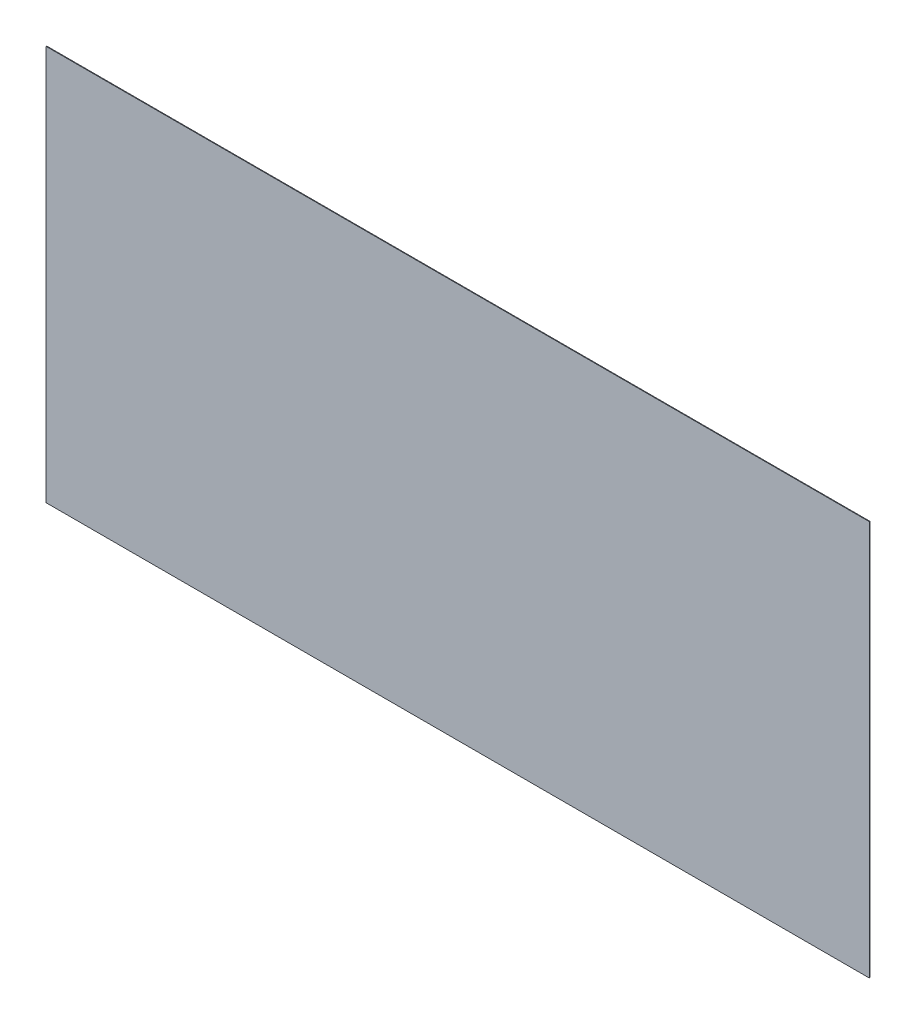
ISO-10303-21;
HEADER;
FILE_DESCRIPTION(('STEP AP214'),'2;1');
FILE_NAME('part.step','',(''),(''),'','','');
FILE_SCHEMA(('AUTOMOTIVE_DESIGN { 1 0 10303 214 1 1 1 1 }'));
ENDSEC;
DATA;
#1=APPLICATION_CONTEXT('core data for automotive mechanical design processes');
#2=APPLICATION_PROTOCOL_DEFINITION('international standard','automotive_design',2000,#1);
#3=PRODUCT_CONTEXT('',#1,'mechanical');
#4=PRODUCT('Part','Part','',(#3));
#5=PRODUCT_RELATED_PRODUCT_CATEGORY('part','',(#4));
#6=PRODUCT_DEFINITION_FORMATION('','',#4);
#7=PRODUCT_DEFINITION_CONTEXT('part definition',#1,'design');
#8=PRODUCT_DEFINITION('design','',#6,#7);
#9=PRODUCT_DEFINITION_SHAPE('','',#8);
#10=(LENGTH_UNIT() NAMED_UNIT(*) SI_UNIT(.MILLI.,.METRE.));
#11=(NAMED_UNIT(*) PLANE_ANGLE_UNIT() SI_UNIT($,.RADIAN.));
#12=(NAMED_UNIT(*) SI_UNIT($,.STERADIAN.) SOLID_ANGLE_UNIT());
#13=UNCERTAINTY_MEASURE_WITH_UNIT(LENGTH_MEASURE(1.E-05),#10,'distance_accuracy_value','');
#14=(GEOMETRIC_REPRESENTATION_CONTEXT(3) GLOBAL_UNCERTAINTY_ASSIGNED_CONTEXT((#13)) GLOBAL_UNIT_ASSIGNED_CONTEXT((#10,
#11,#12)) REPRESENTATION_CONTEXT('',''));
#15=CARTESIAN_POINT('',(0.,0.,0.));
#16=DIRECTION('',(0.,0.,1.));
#17=DIRECTION('',(1.,0.,0.));
#18=AXIS2_PLACEMENT_3D('',#15,#16,#17);
#19=CARTESIAN_POINT('',(600.,288.1,0.9));
#20=DIRECTION('',(-1.,0.,0.));
#21=DIRECTION('',(0.,-1.,0.));
#22=AXIS2_PLACEMENT_3D('',#19,#20,#21);
#23=PLANE('',#22);
#24=DIRECTION('',(0.,1.,0.));
#25=VECTOR('',#24,1.);
#26=CARTESIAN_POINT('',(600.,288.1,0.));
#27=LINE('',#26,#25);
#28=CARTESIAN_POINT('',(600.,-288.1,0.));
#29=VERTEX_POINT('',#28);
#30=CARTESIAN_POINT('',(600.,288.1,0.));
#31=VERTEX_POINT('',#30);
#32=EDGE_CURVE('E102',#29,#31,#27,.T.);
#33=ORIENTED_EDGE('',*,*,#32,.T.);
#34=DIRECTION('',(0.,0.,-1.));
#35=VECTOR('',#34,1.);
#36=CARTESIAN_POINT('',(600.,288.1,0.9));
#37=LINE('',#36,#35);
#38=CARTESIAN_POINT('',(600.,288.1,0.9));
#39=VERTEX_POINT('',#38);
#40=EDGE_CURVE('E11',#39,#31,#37,.T.);
#41=ORIENTED_EDGE('',*,*,#40,.F.);
#42=DIRECTION('',(0.,1.,0.));
#43=VECTOR('',#42,1.);
#44=CARTESIAN_POINT('',(600.,288.1,0.9));
#45=LINE('',#44,#43);
#46=CARTESIAN_POINT('',(600.,-288.1,0.9));
#47=VERTEX_POINT('',#46);
#48=EDGE_CURVE('E90',#47,#39,#45,.T.);
#49=ORIENTED_EDGE('',*,*,#48,.F.);
#50=DIRECTION('',(0.,0.,-1.));
#51=VECTOR('',#50,1.);
#52=CARTESIAN_POINT('',(600.,-288.1,0.9));
#53=LINE('',#52,#51);
#54=EDGE_CURVE('E98',#47,#29,#53,.T.);
#55=ORIENTED_EDGE('',*,*,#54,.T.);
#56=EDGE_LOOP('',(#33,#41,#49,#55));
#57=FACE_BOUND('',#56,.T.);
#58=ADVANCED_FACE('F39',(#57),#23,.F.);
#59=CARTESIAN_POINT('',(-600.,288.1,0.9));
#60=DIRECTION('',(0.,-1.,0.));
#61=DIRECTION('',(0.,0.,-1.));
#62=AXIS2_PLACEMENT_3D('',#59,#60,#61);
#63=PLANE('',#62);
#64=DIRECTION('',(-1.,0.,0.));
#65=VECTOR('',#64,1.);
#66=CARTESIAN_POINT('',(-600.,288.1,0.));
#67=LINE('',#66,#65);
#68=CARTESIAN_POINT('',(-600.,288.1,0.));
#69=VERTEX_POINT('',#68);
#70=EDGE_CURVE('E94',#31,#69,#67,.T.);
#71=ORIENTED_EDGE('',*,*,#70,.T.);
#72=DIRECTION('',(0.,0.,-1.));
#73=VECTOR('',#72,1.);
#74=CARTESIAN_POINT('',(-600.,288.1,0.9));
#75=LINE('',#74,#73);
#76=CARTESIAN_POINT('',(-600.,288.1,0.9));
#77=VERTEX_POINT('',#76);
#78=EDGE_CURVE('E47',#77,#69,#75,.T.);
#79=ORIENTED_EDGE('',*,*,#78,.F.);
#80=DIRECTION('',(-1.,0.,0.));
#81=VECTOR('',#80,1.);
#82=CARTESIAN_POINT('',(-600.,288.1,0.9));
#83=LINE('',#82,#81);
#84=EDGE_CURVE('E85',#39,#77,#83,.T.);
#85=ORIENTED_EDGE('',*,*,#84,.F.);
#86=ORIENTED_EDGE('',*,*,#40,.T.);
#87=EDGE_LOOP('',(#71,#79,#85,#86));
#88=FACE_BOUND('',#87,.T.);
#89=ADVANCED_FACE('F93',(#88),#63,.F.);
#90=CARTESIAN_POINT('',(-600.,288.1,0.9));
#91=DIRECTION('',(1.,0.,0.));
#92=DIRECTION('',(0.,1.,0.));
#93=AXIS2_PLACEMENT_3D('',#90,#91,#92);
#94=PLANE('',#93);
#95=DIRECTION('',(0.,-1.,0.));
#96=VECTOR('',#95,1.);
#97=CARTESIAN_POINT('',(-600.,288.1,0.));
#98=LINE('',#97,#96);
#99=CARTESIAN_POINT('',(-600.,-288.1,0.));
#100=VERTEX_POINT('',#99);
#101=EDGE_CURVE('E72',#69,#100,#98,.T.);
#102=ORIENTED_EDGE('',*,*,#101,.T.);
#103=DIRECTION('',(0.,0.,-1.));
#104=VECTOR('',#103,1.);
#105=CARTESIAN_POINT('',(-600.,-288.1,0.9));
#106=LINE('',#105,#104);
#107=CARTESIAN_POINT('',(-600.,-288.1,0.9));
#108=VERTEX_POINT('',#107);
#109=EDGE_CURVE('E95',#108,#100,#106,.T.);
#110=ORIENTED_EDGE('',*,*,#109,.F.);
#111=DIRECTION('',(0.,-1.,0.));
#112=VECTOR('',#111,1.);
#113=CARTESIAN_POINT('',(-600.,288.1,0.9));
#114=LINE('',#113,#112);
#115=EDGE_CURVE('E88',#77,#108,#114,.T.);
#116=ORIENTED_EDGE('',*,*,#115,.F.);
#117=ORIENTED_EDGE('',*,*,#78,.T.);
#118=EDGE_LOOP('',(#102,#110,#116,#117));
#119=FACE_BOUND('',#118,.T.);
#120=ADVANCED_FACE('F96',(#119),#94,.F.);
#121=CARTESIAN_POINT('',(-600.,-288.1,0.9));
#122=DIRECTION('',(0.,1.,0.));
#123=DIRECTION('',(0.,0.,1.));
#124=AXIS2_PLACEMENT_3D('',#121,#122,#123);
#125=PLANE('',#124);
#126=DIRECTION('',(1.,0.,0.));
#127=VECTOR('',#126,1.);
#128=CARTESIAN_POINT('',(-600.,-288.1,0.));
#129=LINE('',#128,#127);
#130=EDGE_CURVE('E78',#100,#29,#129,.T.);
#131=ORIENTED_EDGE('',*,*,#130,.T.);
#132=ORIENTED_EDGE('',*,*,#54,.F.);
#133=DIRECTION('',(1.,0.,0.));
#134=VECTOR('',#133,1.);
#135=CARTESIAN_POINT('',(-600.,-288.1,0.9));
#136=LINE('',#135,#134);
#137=EDGE_CURVE('E55',#108,#47,#136,.T.);
#138=ORIENTED_EDGE('',*,*,#137,.F.);
#139=ORIENTED_EDGE('',*,*,#109,.T.);
#140=EDGE_LOOP('',(#131,#132,#138,#139));
#141=FACE_BOUND('',#140,.T.);
#142=ADVANCED_FACE('F109',(#141),#125,.F.);
#143=CARTESIAN_POINT('',(0.,0.,0.9));
#144=DIRECTION('',(0.,0.,1.));
#145=DIRECTION('',(1.,0.,0.));
#146=AXIS2_PLACEMENT_3D('',#143,#144,#145);
#147=PLANE('',#146);
#148=ORIENTED_EDGE('',*,*,#48,.T.);
#149=ORIENTED_EDGE('',*,*,#84,.T.);
#150=ORIENTED_EDGE('',*,*,#115,.T.);
#151=ORIENTED_EDGE('',*,*,#137,.T.);
#152=EDGE_LOOP('',(#148,#149,#150,#151));
#153=FACE_BOUND('',#152,.T.);
#154=ADVANCED_FACE('F86',(#153),#147,.T.);
#155=CARTESIAN_POINT('',(0.,0.,0.));
#156=DIRECTION('',(0.,0.,1.));
#157=DIRECTION('',(1.,0.,0.));
#158=AXIS2_PLACEMENT_3D('',#155,#156,#157);
#159=PLANE('',#158);
#160=ORIENTED_EDGE('',*,*,#32,.F.);
#161=ORIENTED_EDGE('',*,*,#130,.F.);
#162=ORIENTED_EDGE('',*,*,#101,.F.);
#163=ORIENTED_EDGE('',*,*,#70,.F.);
#164=EDGE_LOOP('',(#160,#161,#162,#163));
#165=FACE_BOUND('',#164,.T.);
#166=ADVANCED_FACE('F112',(#165),#159,.F.);
#167=CLOSED_SHELL('',(#58,#89,#120,#142,#154,#166));
#168=MANIFOLD_SOLID_BREP('B2',#167);
#169=ADVANCED_BREP_SHAPE_REPRESENTATION('',(#18,#168),#14);
#170=SHAPE_DEFINITION_REPRESENTATION(#9,#169);
ENDSEC;
END-ISO-10303-21;
